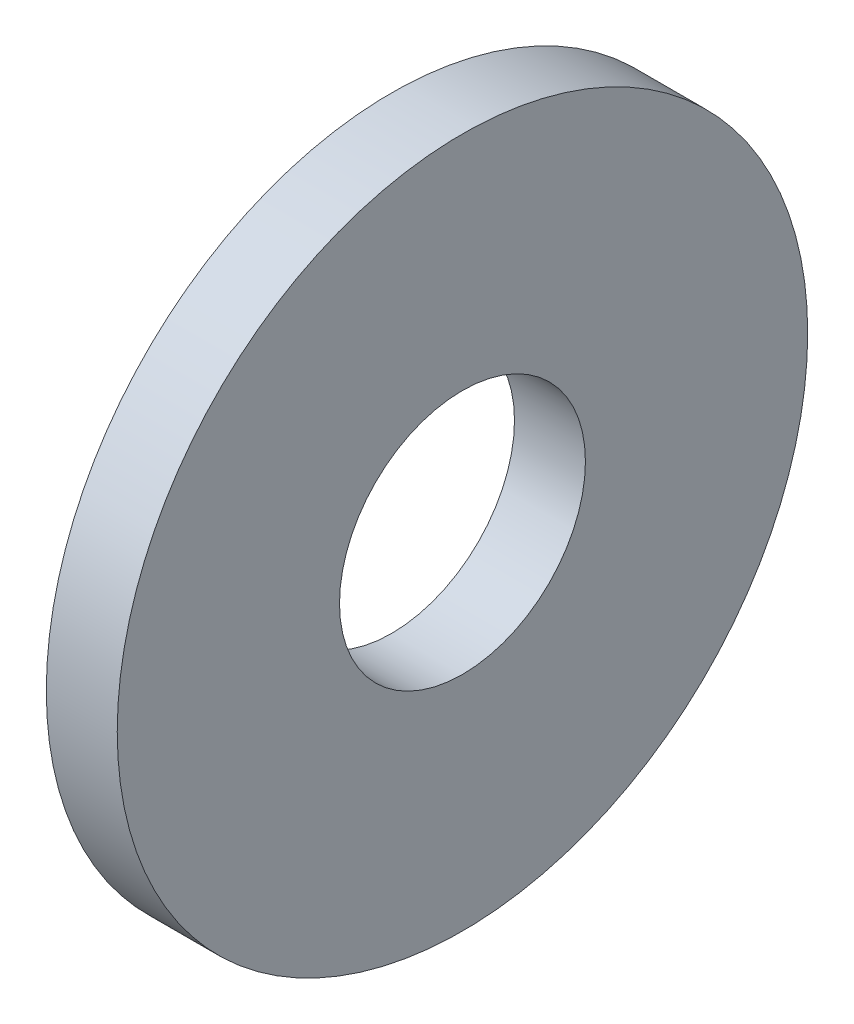
ISO-10303-21;
HEADER;
FILE_DESCRIPTION(('STEP AP214'),'2;1');
FILE_NAME('part.step','',(''),(''),'','','');
FILE_SCHEMA(('AUTOMOTIVE_DESIGN { 1 0 10303 214 1 1 1 1 }'));
ENDSEC;
DATA;
#1=APPLICATION_CONTEXT('core data for automotive mechanical design processes');
#2=APPLICATION_PROTOCOL_DEFINITION('international standard','automotive_design',2000,#1);
#3=PRODUCT_CONTEXT('',#1,'mechanical');
#4=PRODUCT('Part','Part','',(#3));
#5=PRODUCT_RELATED_PRODUCT_CATEGORY('part','',(#4));
#6=PRODUCT_DEFINITION_FORMATION('','',#4);
#7=PRODUCT_DEFINITION_CONTEXT('part definition',#1,'design');
#8=PRODUCT_DEFINITION('design','',#6,#7);
#9=PRODUCT_DEFINITION_SHAPE('','',#8);
#10=(LENGTH_UNIT() NAMED_UNIT(*) SI_UNIT(.MILLI.,.METRE.));
#11=(NAMED_UNIT(*) PLANE_ANGLE_UNIT() SI_UNIT($,.RADIAN.));
#12=(NAMED_UNIT(*) SI_UNIT($,.STERADIAN.) SOLID_ANGLE_UNIT());
#13=UNCERTAINTY_MEASURE_WITH_UNIT(LENGTH_MEASURE(1.E-05),#10,'distance_accuracy_value','');
#14=(GEOMETRIC_REPRESENTATION_CONTEXT(3) GLOBAL_UNCERTAINTY_ASSIGNED_CONTEXT((#13)) GLOBAL_UNIT_ASSIGNED_CONTEXT((#10,
#11,#12)) REPRESENTATION_CONTEXT('',''));
#15=CARTESIAN_POINT('',(0.,0.,0.));
#16=DIRECTION('',(0.,0.,1.));
#17=DIRECTION('',(1.,0.,0.));
#18=AXIS2_PLACEMENT_3D('',#15,#16,#17);
#19=CARTESIAN_POINT('',(1.143,0.,0.));
#20=DIRECTION('',(1.,0.,0.));
#21=DIRECTION('',(0.,0.,-1.));
#22=AXIS2_PLACEMENT_3D('',#19,#20,#21);
#23=PLANE('',#22);
#24=CARTESIAN_POINT('',(1.143,0.,0.));
#25=DIRECTION('',(1.,0.,0.));
#26=DIRECTION('',(0.,0.,-1.));
#27=AXIS2_PLACEMENT_3D('',#24,#25,#26);
#28=CIRCLE('',#27,5.5626);
#29=CARTESIAN_POINT('',(1.143,0.,-5.5626));
#30=VERTEX_POINT('',#29);
#31=EDGE_CURVE('E10',#30,#30,#28,.T.);
#32=ORIENTED_EDGE('',*,*,#31,.T.);
#33=EDGE_LOOP('',(#32));
#34=FACE_BOUND('',#33,.T.);
#35=CARTESIAN_POINT('',(1.143,0.,0.));
#36=DIRECTION('',(1.,0.,0.));
#37=DIRECTION('',(0.,0.,-1.));
#38=AXIS2_PLACEMENT_3D('',#35,#36,#37);
#39=CIRCLE('',#38,1.9812);
#40=CARTESIAN_POINT('',(1.143,0.,-1.9812));
#41=VERTEX_POINT('',#40);
#42=EDGE_CURVE('E41',#41,#41,#39,.T.);
#43=ORIENTED_EDGE('',*,*,#42,.F.);
#44=EDGE_LOOP('',(#43));
#45=FACE_BOUND('',#44,.T.);
#46=ADVANCED_FACE('F30',(#34,#45),#23,.T.);
#47=CARTESIAN_POINT('',(0.,0.,0.));
#48=DIRECTION('',(1.,0.,0.));
#49=DIRECTION('',(0.,0.,-1.));
#50=AXIS2_PLACEMENT_3D('',#47,#48,#49);
#51=PLANE('',#50);
#52=CARTESIAN_POINT('',(0.,0.,0.));
#53=DIRECTION('',(1.,0.,0.));
#54=DIRECTION('',(0.,0.,-1.));
#55=AXIS2_PLACEMENT_3D('',#52,#53,#54);
#56=CIRCLE('',#55,5.5626);
#57=CARTESIAN_POINT('',(0.,0.,-5.5626));
#58=VERTEX_POINT('',#57);
#59=EDGE_CURVE('E34',#58,#58,#56,.T.);
#60=ORIENTED_EDGE('',*,*,#59,.F.);
#61=EDGE_LOOP('',(#60));
#62=FACE_BOUND('',#61,.T.);
#63=CARTESIAN_POINT('',(0.,0.,0.));
#64=DIRECTION('',(1.,0.,0.));
#65=DIRECTION('',(0.,0.,-1.));
#66=AXIS2_PLACEMENT_3D('',#63,#64,#65);
#67=CIRCLE('',#66,1.9812);
#68=CARTESIAN_POINT('',(0.,0.,-1.9812));
#69=VERTEX_POINT('',#68);
#70=EDGE_CURVE('E43',#69,#69,#67,.T.);
#71=ORIENTED_EDGE('',*,*,#70,.T.);
#72=EDGE_LOOP('',(#71));
#73=FACE_BOUND('',#72,.T.);
#74=ADVANCED_FACE('F53',(#62,#73),#51,.F.);
#75=CARTESIAN_POINT('',(1.143,0.,0.));
#76=DIRECTION('',(-1.,0.,0.));
#77=DIRECTION('',(0.,0.,1.));
#78=AXIS2_PLACEMENT_3D('',#75,#76,#77);
#79=CYLINDRICAL_SURFACE('',#78,5.5626);
#80=ORIENTED_EDGE('',*,*,#31,.F.);
#81=EDGE_LOOP('',(#80));
#82=FACE_BOUND('',#81,.T.);
#83=ORIENTED_EDGE('',*,*,#59,.T.);
#84=EDGE_LOOP('',(#83));
#85=FACE_BOUND('',#84,.T.);
#86=ADVANCED_FACE('F32',(#82,#85),#79,.T.);
#87=CARTESIAN_POINT('',(1.143,0.,0.));
#88=DIRECTION('',(-1.,0.,0.));
#89=DIRECTION('',(0.,0.,1.));
#90=AXIS2_PLACEMENT_3D('',#87,#88,#89);
#91=CYLINDRICAL_SURFACE('',#90,1.9812);
#92=ORIENTED_EDGE('',*,*,#42,.T.);
#93=EDGE_LOOP('',(#92));
#94=FACE_BOUND('',#93,.T.);
#95=ORIENTED_EDGE('',*,*,#70,.F.);
#96=EDGE_LOOP('',(#95));
#97=FACE_BOUND('',#96,.T.);
#98=ADVANCED_FACE('F49',(#94,#97),#91,.F.);
#99=CLOSED_SHELL('',(#46,#74,#86,#98));
#100=MANIFOLD_SOLID_BREP('B2',#99);
#101=ADVANCED_BREP_SHAPE_REPRESENTATION('',(#18,#100),#14);
#102=SHAPE_DEFINITION_REPRESENTATION(#9,#101);
ENDSEC;
END-ISO-10303-21;
